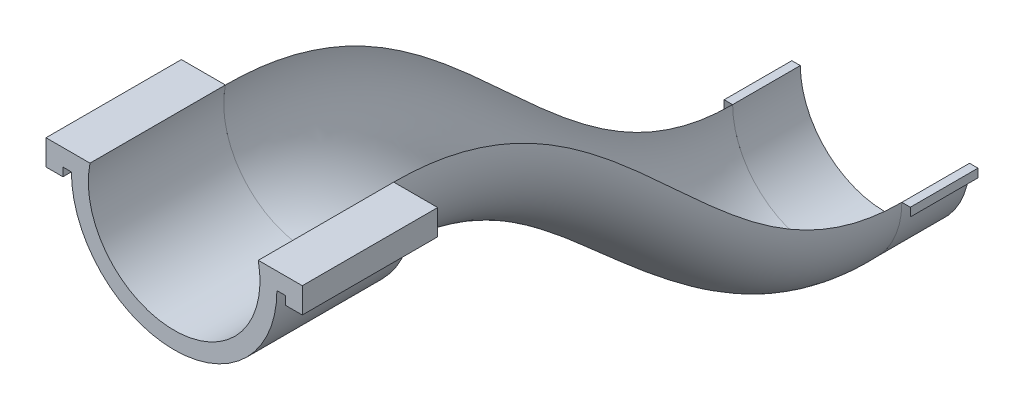
ISO-10303-21;
HEADER;
FILE_DESCRIPTION(('STEP AP214'),'2;1');
FILE_NAME('part.step','',(''),(''),'','','');
FILE_SCHEMA(('AUTOMOTIVE_DESIGN { 1 0 10303 214 1 1 1 1 }'));
ENDSEC;
DATA;
#1=APPLICATION_CONTEXT('core data for automotive mechanical design processes');
#2=APPLICATION_PROTOCOL_DEFINITION('international standard','automotive_design',2000,#1);
#3=PRODUCT_CONTEXT('',#1,'mechanical');
#4=PRODUCT('Part','Part','',(#3));
#5=PRODUCT_RELATED_PRODUCT_CATEGORY('part','',(#4));
#6=PRODUCT_DEFINITION_FORMATION('','',#4);
#7=PRODUCT_DEFINITION_CONTEXT('part definition',#1,'design');
#8=PRODUCT_DEFINITION('design','',#6,#7);
#9=PRODUCT_DEFINITION_SHAPE('','',#8);
#10=(LENGTH_UNIT() NAMED_UNIT(*) SI_UNIT(.MILLI.,.METRE.));
#11=(NAMED_UNIT(*) PLANE_ANGLE_UNIT() SI_UNIT($,.RADIAN.));
#12=(NAMED_UNIT(*) SI_UNIT($,.STERADIAN.) SOLID_ANGLE_UNIT());
#13=UNCERTAINTY_MEASURE_WITH_UNIT(LENGTH_MEASURE(1.E-05),#10,'distance_accuracy_value','');
#14=(GEOMETRIC_REPRESENTATION_CONTEXT(3) GLOBAL_UNCERTAINTY_ASSIGNED_CONTEXT((#13)) GLOBAL_UNIT_ASSIGNED_CONTEXT((#10,
#11,#12)) REPRESENTATION_CONTEXT('',''));
#15=CARTESIAN_POINT('',(0.,0.,0.));
#16=DIRECTION('',(0.,0.,1.));
#17=DIRECTION('',(1.,0.,0.));
#18=AXIS2_PLACEMENT_3D('',#15,#16,#17);
#19=CARTESIAN_POINT('',(-49.9995961359069,49.7990367043275,-300.));
#20=CARTESIAN_POINT('',(-49.9995961359069,49.7990367043276,-186.635093062161));
#21=CARTESIAN_POINT('',(-49.7236529956355,209.999999999992,-137.521090849917));
#22=CARTESIAN_POINT('',(-49.7236529956355,210.,0.));
#23=CARTESIAN_POINT('',(-49.9857710790284,46.3593674942618,-300.));
#24=CARTESIAN_POINT('',(-50.2395997585209,46.2476525838238,-186.635093042549));
#25=CARTESIAN_POINT('',(-50.2289829285867,206.336900969051,-137.521090646186));
#26=CARTESIAN_POINT('',(-50.4828116080792,206.22518605862,0.));
#27=CARTESIAN_POINT('',(-49.2625450584069,39.6438335125289,-300.));
#28=CARTESIAN_POINT('',(-49.9618479299618,39.242949902246,-186.635093003326));
#29=CARTESIAN_POINT('',(-50.4197005537794,199.043029587628,-137.521090238725));
#30=CARTESIAN_POINT('',(-51.1190034253343,198.642145977353,0.));
#31=CARTESIAN_POINT('',(-46.2909459407242,30.2602417774451,-300.));
#32=CARTESIAN_POINT('',(-47.4575577692636,29.2910114273615,-186.63509294449));
#33=CARTESIAN_POINT('',(-48.4172122425995,188.522744372944,-137.521089627533));
#34=CARTESIAN_POINT('',(-49.5838240711389,187.553514022867,0.));
#35=CARTESIAN_POINT('',(-42.4104889861624,23.184107101713,-300.));
#36=CARTESIAN_POINT('',(-43.7867134492801,21.6765254672473,-186.63509289546));
#37=CARTESIAN_POINT('',(-44.9847246343059,180.369907128448,-137.521089118206));
#38=CARTESIAN_POINT('',(-46.3609490974236,178.862325493988,0.));
#39=CARTESIAN_POINT('',(-38.5626491381919,18.0665263114237,-299.999999999999));
#40=CARTESIAN_POINT('',(-39.9923028896601,16.1230413752315,-186.635092856236));
#41=CARTESIAN_POINT('',(-41.2667386247257,174.380519734706,-137.521088710745));
#42=CARTESIAN_POINT('',(-42.696392376194,172.437034798519,0.));
#43=CARTESIAN_POINT('',(-35.3309207200381,14.5269083367518,-300.));
#44=CARTESIAN_POINT('',(-36.7411982428594,12.259811063786,-186.635092826818));
#45=CARTESIAN_POINT('',(-38.013504195545,170.193677086487,-137.521088405149));
#46=CARTESIAN_POINT('',(-39.4237817183662,167.926579813527,0.));
#47=CARTESIAN_POINT('',(-31.7781191274317,11.3091398482944,-300.));
#48=CARTESIAN_POINT('',(-33.1076255255293,8.72887907961716,-186.6350927974));
#49=CARTESIAN_POINT('',(-34.3164067997583,166.349581606607,-137.521088099553));
#50=CARTESIAN_POINT('',(-35.6459131978559,163.769320837935,0.));
#51=CARTESIAN_POINT('',(-27.9285288436859,8.43914732918972,-300.));
#52=CARTESIAN_POINT('',(-29.1136633833439,5.56435656091234,-186.635092767983));
#53=CARTESIAN_POINT('',(-30.1953192454001,162.890529088302,-137.521087793957));
#54=CARTESIAN_POINT('',(-31.3804537850581,160.01573832003,0.));
#55=CARTESIAN_POINT('',(-23.8094488339025,5.94138201827792,-300.));
#56=CARTESIAN_POINT('',(-24.7834001165026,2.79937114965999,-186.635092738565));
#57=CARTESIAN_POINT('',(-25.6711191677679,159.85832357671,-137.521087488361));
#58=CARTESIAN_POINT('',(-26.6450704503679,156.716312708097,0.));
#59=CARTESIAN_POINT('',(-19.4413726456585,3.84109217588112,-300.));
#60=CARTESIAN_POINT('',(-20.1882942934233,0.492863891781062,-186.635092709147));
#61=CARTESIAN_POINT('',(-20.8662301561201,157.345598903349,-137.521087182765));
#62=CARTESIAN_POINT('',(-21.6131518038848,153.997370619253,0.));
#63=CARTESIAN_POINT('',(-14.8581502520455,2.16309798919661,-300.));
#64=CARTESIAN_POINT('',(-15.3882543230493,-1.32683877520418,-186.635092679729));
#65=CARTESIAN_POINT('',(-15.8666190552523,155.384187756063,-137.521086877169));
#66=CARTESIAN_POINT('',(-16.3967231262561,151.894250991667,0.));
#67=CARTESIAN_POINT('',(-10.0682648029117,0.932449978969549,-300.));
#68=CARTESIAN_POINT('',(-10.3950198626838,-2.65006238087401,-186.635092650311));
#69=CARTESIAN_POINT('',(-10.6872820299221,153.968388554951,-137.521086571573));
#70=CARTESIAN_POINT('',(-11.0140370896942,150.385876195111,0.));
#71=CARTESIAN_POINT('',(-5.12838212363237,0.174073325261765,-300.));
#72=CARTESIAN_POINT('',(-5.26934241795265,-3.45625385484332,-186.635092620893));
#73=CARTESIAN_POINT('',(-5.39305626600597,153.11438226072,-137.521086265977));
#74=CARTESIAN_POINT('',(-5.53401656032624,149.484055080619,0.));
#75=CARTESIAN_POINT('',(-6.68724711022639E-09,-0.0870358964227742,-300.));
#76=CARTESIAN_POINT('',(8.97858296970237E-07,-3.73108305498303,-186.635092591475));
#77=CARTESIAN_POINT('',(1.80240383758125E-06,152.825833082125,-137.521085960381));
#78=CARTESIAN_POINT('',(2.7069493955395E-06,149.181785923569,0.));
#79=CARTESIAN_POINT('',(5.12838213970486,0.1740733383782,-300.));
#80=CARTESIAN_POINT('',(5.26934026213746,-3.45625478804245,-186.635092562057));
#81=CARTESIAN_POINT('',(5.3930519383031,153.114380381206,-137.521085654785));
#82=CARTESIAN_POINT('',(5.53401006073571,149.484052254789,0.));
#83=CARTESIAN_POINT('',(10.0682647776573,0.932449947445672,-300.));
#84=CARTESIAN_POINT('',(10.3950232305552,-2.65006015152915,-186.63509253264));
#85=CARTESIAN_POINT('',(10.6872887909192,153.968393045165,-137.521085349189));
#86=CARTESIAN_POINT('',(11.0140472438172,150.385882946194,0.));
#87=CARTESIAN_POINT('',(14.8581502966655,2.16309805183858,-300.));
#88=CARTESIAN_POINT('',(15.3882485276953,-1.32684308781143,-186.635092503222));
#89=CARTESIAN_POINT('',(15.8666074199243,155.384179068208,-137.521085043593));
#90=CARTESIAN_POINT('',(16.3967056509542,151.894237928561,0.));
#91=CARTESIAN_POINT('',(19.4413725637152,3.84109205691307,-300.000000000001));
#92=CARTESIAN_POINT('',(20.1883036844637,0.49287111052343,-186.635092473804));
#93=CARTESIAN_POINT('',(20.8662490201444,157.345613459803,-137.521084737997));
#94=CARTESIAN_POINT('',(21.6131801408929,153.997392513417,0.));
#95=CARTESIAN_POINT('',(23.8094489858663,5.94138224103554,-300.));
#96=CARTESIAN_POINT('',(24.7833929224077,2.79936562273601,-186.635092444386));
#97=CARTESIAN_POINT('',(25.6711046276143,159.858312300106,-137.521084432401));
#98=CARTESIAN_POINT('',(26.6450485641556,156.716295681809,0.));
#99=CARTESIAN_POINT('',(27.9285285633594,8.43914691713874,-300.));
#100=CARTESIAN_POINT('',(29.1135892981198,5.56429837061731,-186.635092414968));
#101=CARTESIAN_POINT('',(30.1951713552785,162.890413119766,-137.521084126805));
#102=CARTESIAN_POINT('',(31.3802320900389,160.015564573247,0.));
#103=CARTESIAN_POINT('',(31.7781196249931,11.309140580226,-300.));
#104=CARTESIAN_POINT('',(33.1075905681224,8.7288519057495,-186.63509238555));
#105=CARTESIAN_POINT('',(34.3163363873829,166.349526526943,-137.521083821209));
#106=CARTESIAN_POINT('',(35.6458073305123,163.769237852469,0.));
#107=CARTESIAN_POINT('',(35.3309200020894,14.5269072804505,-300.));
#108=CARTESIAN_POINT('',(36.7412203420088,12.2598280577145,-186.635092356133));
#109=CARTESIAN_POINT('',(38.0135491117925,170.193712130649,-137.521083515613));
#110=CARTESIAN_POINT('',(39.4238494517119,167.926632907915,0.));
#111=CARTESIAN_POINT('',(38.5626487651922,18.0665257619389,-300.));
#112=CARTESIAN_POINT('',(39.9923163888537,16.12305178541,-186.635092326715));
#113=CARTESIAN_POINT('',(41.2667659961126,174.380541104552,-137.521083210016));
#114=CARTESIAN_POINT('',(42.6964336197741,172.437067128025,0.));
#115=CARTESIAN_POINT('',(42.4105070338171,23.184133665319,-300.000000000001));
#116=CARTESIAN_POINT('',(43.7867043307883,21.6765265971737,-186.635092287492));
#117=CARTESIAN_POINT('',(44.9846883496677,180.369882824699,-137.521082802556));
#118=CARTESIAN_POINT('',(46.3608856466389,178.862275756555,0.));
#119=CARTESIAN_POINT('',(46.2909353677802,30.2602262156396,-299.999999999998));
#120=CARTESIAN_POINT('',(47.4575659714199,29.2910130075361,-186.63509223846));
#121=CARTESIAN_POINT('',(48.417239219856,188.522763095104,-137.521082293228));
#122=CARTESIAN_POINT('',(49.5838698234956,187.553549887002,0.));
#123=CARTESIAN_POINT('',(49.2625506154544,39.6438416916677,-300.000000000001));
#124=CARTESIAN_POINT('',(49.9618431816247,39.2429487288792,-186.635092179626));
#125=CARTESIAN_POINT('',(50.4196855000577,199.043019061763,-137.521081682037));
#126=CARTESIAN_POINT('',(51.1189780662281,198.642126098975,0.));
#127=CARTESIAN_POINT('',(49.9857710790284,46.3593674942618,-300.));
#128=CARTESIAN_POINT('',(50.2395997585209,46.2476525838238,-186.635092140402));
#129=CARTESIAN_POINT('',(50.2289829285867,206.336900969058,-137.521081274575));
#130=CARTESIAN_POINT('',(50.4828116080792,206.22518605862,0.));
#131=CARTESIAN_POINT('',(49.9995961359069,49.7990367043275,-300.));
#132=CARTESIAN_POINT('',(49.9995961359069,49.7990367043275,-186.63509212079));
#133=CARTESIAN_POINT('',(49.7236529956355,210.,-137.521081070844));
#134=CARTESIAN_POINT('',(49.7236529956355,210.,0.));
#135=B_SPLINE_SURFACE_WITH_KNOTS('',3,3,((#19,#20,#21,#22),(#23,#24,#25,#26),(#27,#28,#29,#30),
(#31,#32,#33,#34),(#35,#36,#37,#38),(#39,#40,#41,#42),(#43,#44,#45,#46),(#47,#48,#49,#50),(#51,
#52,#53,#54),(#55,#56,#57,#58),(#59,#60,#61,#62),(#63,#64,#65,#66),(#67,#68,#69,#70),(#71,#72,
#73,#74),(#75,#76,#77,#78),(#79,#80,#81,#82),(#83,#84,#85,#86),(#87,#88,#89,#90),(#91,#92,#93,
#94),(#95,#96,#97,#98),(#99,#100,#101,#102),(#103,#104,#105,#106),(#107,#108,#109,#110),(#111,
#112,#113,#114),(#115,#116,#117,#118),(#119,#120,#121,#122),(#123,#124,#125,#126),(#127,#128,
#129,#130),(#131,#132,#133,#134)),.UNSPECIFIED.,.F.,.F.,.F.,(4,1,1,1,1,1,1,1,1,1,1,1,1,1,1,1,1,
1,1,1,1,1,1,1,1,1,4),(4,4),(0.,0.0625,0.125,0.1875,0.21875,0.25,0.28125,0.3125,0.34375,0.375,
0.40625,0.4375,0.46875,0.5,0.53125,0.5625,0.59375,0.625,0.65625,0.6875,0.71875,0.75,0.78125,
0.8125,0.875,0.9375,1.),(0.,1.),.UNSPECIFIED.);
#136=CARTESIAN_POINT('',(-49.9995961359069,49.7990367043275,-300.));
#137=CARTESIAN_POINT('',(-49.9857710790284,46.3593674942618,-300.));
#138=CARTESIAN_POINT('',(-49.2625450584069,39.6438335125289,-300.));
#139=CARTESIAN_POINT('',(-46.2909459407242,30.2602417774451,-300.));
#140=CARTESIAN_POINT('',(-42.4104889861624,23.184107101713,-300.));
#141=CARTESIAN_POINT('',(-38.5626491381919,18.0665263114237,-299.999999999999));
#142=CARTESIAN_POINT('',(-35.3309207200381,14.5269083367518,-300.));
#143=CARTESIAN_POINT('',(-31.7781191274317,11.3091398482944,-300.));
#144=CARTESIAN_POINT('',(-27.9285288436859,8.43914732918972,-300.));
#145=CARTESIAN_POINT('',(-23.8094488339025,5.94138201827792,-300.));
#146=CARTESIAN_POINT('',(-19.4413726456585,3.84109217588112,-300.));
#147=CARTESIAN_POINT('',(-14.8581502520455,2.16309798919661,-300.));
#148=CARTESIAN_POINT('',(-10.0682648029117,0.932449978969549,-300.));
#149=CARTESIAN_POINT('',(-5.12838212363237,0.174073325261765,-300.));
#150=CARTESIAN_POINT('',(-6.68724711022639E-09,-0.0870358964227742,-300.));
#151=CARTESIAN_POINT('',(5.12838213970486,0.1740733383782,-300.));
#152=CARTESIAN_POINT('',(10.0682647776573,0.932449947445672,-300.));
#153=CARTESIAN_POINT('',(14.8581502966655,2.16309805183858,-300.));
#154=CARTESIAN_POINT('',(19.4413725637152,3.84109205691307,-300.000000000001));
#155=CARTESIAN_POINT('',(23.8094489858663,5.94138224103554,-300.));
#156=CARTESIAN_POINT('',(27.9285285633594,8.43914691713874,-300.));
#157=CARTESIAN_POINT('',(31.7781196249931,11.309140580226,-300.));
#158=CARTESIAN_POINT('',(35.3309200020894,14.5269072804505,-300.));
#159=CARTESIAN_POINT('',(38.5626487651922,18.0665257619389,-300.));
#160=CARTESIAN_POINT('',(42.4105070338171,23.184133665319,-300.000000000001));
#161=CARTESIAN_POINT('',(46.2909353677802,30.2602262156396,-299.999999999998));
#162=CARTESIAN_POINT('',(49.2625506154544,39.6438416916677,-300.000000000001));
#163=CARTESIAN_POINT('',(49.9857710790284,46.3593674942618,-300.));
#164=CARTESIAN_POINT('',(49.9995961359069,49.7990367043275,-300.));
#165=B_SPLINE_CURVE_WITH_KNOTS('',3,(#136,#137,#138,#139,#140,#141,#142,#143,#144,#145,#146,
#147,#148,#149,#150,#151,#152,#153,#154,#155,#156,#157,#158,#159,#160,#161,#162,#163,#164),
.UNSPECIFIED.,.F.,.F.,(4,1,1,1,1,1,1,1,1,1,1,1,1,1,1,1,1,1,1,1,1,1,1,1,1,1,4),(0.,0.0625,0.125,
0.1875,0.21875,0.25,0.28125,0.3125,0.34375,0.375,0.40625,0.4375,0.46875,0.5,0.53125,0.5625,
0.59375,0.625,0.65625,0.6875,0.71875,0.75,0.78125,0.8125,0.875,0.9375,1.),.UNSPECIFIED.);
#166=CARTESIAN_POINT('',(-49.9995961359069,49.7990367043275,-300.));
#167=VERTEX_POINT('',#166);
#168=CARTESIAN_POINT('',(49.9995961359069,49.7990367043275,-300.));
#169=VERTEX_POINT('',#168);
#170=EDGE_CURVE('E13',#167,#169,#165,.T.);
#171=CARTESIAN_POINT('',(49.9995961359069,49.7990367043275,-300.));
#172=CARTESIAN_POINT('',(49.9995961359069,49.7990367043275,-186.63509212079));
#173=CARTESIAN_POINT('',(49.7236529956355,210.,-137.521081070844));
#174=CARTESIAN_POINT('',(49.7236529956355,210.,0.));
#175=B_SPLINE_CURVE_WITH_KNOTS('',3,(#171,#172,#173,#174),.UNSPECIFIED.,.F.,.F.,(4,4),(0.,1.),.UNSPECIFIED.);
#176=CARTESIAN_POINT('',(49.7236529956355,210.,0.));
#177=VERTEX_POINT('',#176);
#178=EDGE_CURVE('E71',#169,#177,#175,.T.);
#179=CARTESIAN_POINT('',(-49.7236529956355,210.,0.));
#180=CARTESIAN_POINT('',(-50.4828116080792,206.22518605862,0.));
#181=CARTESIAN_POINT('',(-51.1190034253343,198.642145977353,0.));
#182=CARTESIAN_POINT('',(-49.5838240711389,187.553514022867,0.));
#183=CARTESIAN_POINT('',(-46.3609490974236,178.862325493988,0.));
#184=CARTESIAN_POINT('',(-42.696392376194,172.437034798519,0.));
#185=CARTESIAN_POINT('',(-39.4237817183662,167.926579813527,0.));
#186=CARTESIAN_POINT('',(-35.6459131978559,163.769320837935,0.));
#187=CARTESIAN_POINT('',(-31.3804537850581,160.01573832003,0.));
#188=CARTESIAN_POINT('',(-26.6450704503679,156.716312708097,0.));
#189=CARTESIAN_POINT('',(-21.6131518038848,153.997370619253,0.));
#190=CARTESIAN_POINT('',(-16.3967231262561,151.894250991667,0.));
#191=CARTESIAN_POINT('',(-11.0140370896942,150.385876195111,0.));
#192=CARTESIAN_POINT('',(-5.53401656032624,149.484055080619,0.));
#193=CARTESIAN_POINT('',(2.7069493955395E-06,149.181785923569,0.));
#194=CARTESIAN_POINT('',(5.53401006073571,149.484052254789,0.));
#195=CARTESIAN_POINT('',(11.0140472438172,150.385882946194,0.));
#196=CARTESIAN_POINT('',(16.3967056509542,151.894237928561,0.));
#197=CARTESIAN_POINT('',(21.6131801408929,153.997392513417,0.));
#198=CARTESIAN_POINT('',(26.6450485641556,156.716295681809,0.));
#199=CARTESIAN_POINT('',(31.3802320900389,160.015564573247,0.));
#200=CARTESIAN_POINT('',(35.6458073305123,163.769237852469,0.));
#201=CARTESIAN_POINT('',(39.4238494517119,167.926632907915,0.));
#202=CARTESIAN_POINT('',(42.6964336197741,172.437067128025,0.));
#203=CARTESIAN_POINT('',(46.3608856466389,178.862275756555,0.));
#204=CARTESIAN_POINT('',(49.5838698234956,187.553549887002,0.));
#205=CARTESIAN_POINT('',(51.1189780662281,198.642126098975,0.));
#206=CARTESIAN_POINT('',(50.4828116080792,206.22518605862,0.));
#207=CARTESIAN_POINT('',(49.7236529956355,210.,0.));
#208=B_SPLINE_CURVE_WITH_KNOTS('',3,(#179,#180,#181,#182,#183,#184,#185,#186,#187,#188,#189,
#190,#191,#192,#193,#194,#195,#196,#197,#198,#199,#200,#201,#202,#203,#204,#205,#206,#207),
.UNSPECIFIED.,.F.,.F.,(4,1,1,1,1,1,1,1,1,1,1,1,1,1,1,1,1,1,1,1,1,1,1,1,1,1,4),(0.,0.0625,0.125,
0.1875,0.21875,0.25,0.28125,0.3125,0.34375,0.375,0.40625,0.4375,0.46875,0.5,0.53125,0.5625,
0.59375,0.625,0.65625,0.6875,0.71875,0.75,0.78125,0.8125,0.875,0.9375,1.),.UNSPECIFIED.);
#209=CARTESIAN_POINT('',(-49.7236529956355,210.,0.));
#210=VERTEX_POINT('',#209);
#211=EDGE_CURVE('E79',#177,#210,#208,.F.);
#212=CARTESIAN_POINT('',(-49.9995961359069,49.7990367043275,-300.));
#213=CARTESIAN_POINT('',(-49.9995961359069,49.7990367043276,-186.635093062161));
#214=CARTESIAN_POINT('',(-49.7236529956355,209.999999999992,-137.521090849917));
#215=CARTESIAN_POINT('',(-49.7236529956355,210.,0.));
#216=B_SPLINE_CURVE_WITH_KNOTS('',3,(#212,#213,#214,#215),.UNSPECIFIED.,.F.,.F.,(4,4),(0.,1.),.UNSPECIFIED.);
#217=EDGE_CURVE('E63',#210,#167,#216,.F.);
#218=ORIENTED_EDGE('',*,*,#170,.T.);
#219=ORIENTED_EDGE('',*,*,#178,.T.);
#220=ORIENTED_EDGE('',*,*,#211,.T.);
#221=ORIENTED_EDGE('',*,*,#217,.T.);
#222=EDGE_LOOP('',(#218,#219,#220,#221));
#223=FACE_BOUND('',#222,.T.);
#224=ADVANCED_FACE('F60',(#223),#135,.T.);
#225=OPEN_SHELL('',(#224));
#226=SHELL_BASED_SURFACE_MODEL('B2',(#225));
#227=CARTESIAN_POINT('',(-75.7192435593274,200.,80.));
#228=DIRECTION('',(1.,0.,0.));
#229=DIRECTION('',(0.,0.,-1.));
#230=AXIS2_PLACEMENT_3D('',#227,#228,#229);
#231=PLANE('',#230);
#232=DIRECTION('',(0.,1.,0.));
#233=VECTOR('',#232,1.);
#234=CARTESIAN_POINT('',(-75.7192435593274,200.,0.));
#235=LINE('',#234,#233);
#236=CARTESIAN_POINT('',(-75.7192435593274,210.,0.));
#237=VERTEX_POINT('',#236);
#238=CARTESIAN_POINT('',(-75.7192435593274,195.,0.));
#239=VERTEX_POINT('',#238);
#240=EDGE_CURVE('E260',#237,#239,#235,.F.);
#241=ORIENTED_EDGE('',*,*,#240,.T.);
#242=DIRECTION('',(0.,0.,-1.));
#243=VECTOR('',#242,1.);
#244=CARTESIAN_POINT('',(-75.7192435593274,195.,80.));
#245=LINE('',#244,#243);
#246=CARTESIAN_POINT('',(-75.7192435593274,195.,80.));
#247=VERTEX_POINT('',#246);
#248=EDGE_CURVE('E58',#247,#239,#245,.T.);
#249=ORIENTED_EDGE('',*,*,#248,.F.);
#250=DIRECTION('',(0.,1.,0.));
#251=VECTOR('',#250,1.);
#252=CARTESIAN_POINT('',(-75.7192435593274,200.,80.));
#253=LINE('',#252,#251);
#254=CARTESIAN_POINT('',(-75.7192435593274,210.,80.));
#255=VERTEX_POINT('',#254);
#256=EDGE_CURVE('E208',#255,#247,#253,.F.);
#257=ORIENTED_EDGE('',*,*,#256,.F.);
#258=DIRECTION('',(0.,0.,-1.));
#259=VECTOR('',#258,1.);
#260=CARTESIAN_POINT('',(-75.7192435593274,210.,80.));
#261=LINE('',#260,#259);
#262=EDGE_CURVE('E256',#255,#237,#261,.T.);
#263=ORIENTED_EDGE('',*,*,#262,.T.);
#264=EDGE_LOOP('',(#241,#249,#257,#263));
#265=FACE_BOUND('',#264,.T.);
#266=ADVANCED_FACE('F140',(#265),#231,.F.);
#267=CARTESIAN_POINT('',(-65.7192435593274,195.,80.));
#268=DIRECTION('',(0.,-1.,0.));
#269=DIRECTION('',(0.,0.,-1.));
#270=AXIS2_PLACEMENT_3D('',#267,#268,#269);
#271=PLANE('',#270);
#272=DIRECTION('',(-1.,0.,0.));
#273=VECTOR('',#272,1.);
#274=CARTESIAN_POINT('',(-65.7192435593274,195.,0.));
#275=LINE('',#274,#273);
#276=CARTESIAN_POINT('',(-65.7192435593274,195.,0.));
#277=VERTEX_POINT('',#276);
#278=EDGE_CURVE('E263',#277,#239,#275,.T.);
#279=ORIENTED_EDGE('',*,*,#278,.F.);
#280=DIRECTION('',(0.,0.,-1.));
#281=VECTOR('',#280,1.);
#282=CARTESIAN_POINT('',(-65.7192435593274,195.,80.));
#283=LINE('',#282,#281);
#284=CARTESIAN_POINT('',(-65.7192435593274,195.,80.));
#285=VERTEX_POINT('',#284);
#286=EDGE_CURVE('E148',#285,#277,#283,.T.);
#287=ORIENTED_EDGE('',*,*,#286,.F.);
#288=DIRECTION('',(-1.,0.,0.));
#289=VECTOR('',#288,1.);
#290=CARTESIAN_POINT('',(-65.7192435593274,195.,80.));
#291=LINE('',#290,#289);
#292=EDGE_CURVE('E325',#285,#247,#291,.T.);
#293=ORIENTED_EDGE('',*,*,#292,.T.);
#294=ORIENTED_EDGE('',*,*,#248,.T.);
#295=EDGE_LOOP('',(#279,#287,#293,#294));
#296=FACE_BOUND('',#295,.T.);
#297=ADVANCED_FACE('F312',(#296),#271,.T.);
#298=CARTESIAN_POINT('',(-65.7192435593274,200.,80.));
#299=DIRECTION('',(1.,0.,0.));
#300=DIRECTION('',(0.,0.,-1.));
#301=AXIS2_PLACEMENT_3D('',#298,#299,#300);
#302=PLANE('',#301);
#303=DIRECTION('',(0.,-1.,0.));
#304=VECTOR('',#303,1.);
#305=CARTESIAN_POINT('',(-65.7192435593274,200.,0.));
#306=LINE('',#305,#304);
#307=CARTESIAN_POINT('',(-65.7192435593274,200.,0.));
#308=VERTEX_POINT('',#307);
#309=EDGE_CURVE('E266',#308,#277,#306,.T.);
#310=ORIENTED_EDGE('',*,*,#309,.F.);
#311=DIRECTION('',(0.,0.,-1.));
#312=VECTOR('',#311,1.);
#313=CARTESIAN_POINT('',(-65.7192435593274,200.,80.));
#314=LINE('',#313,#312);
#315=CARTESIAN_POINT('',(-65.7192435593274,200.,80.));
#316=VERTEX_POINT('',#315);
#317=EDGE_CURVE('E302',#316,#308,#314,.T.);
#318=ORIENTED_EDGE('',*,*,#317,.F.);
#319=DIRECTION('',(0.,-1.,0.));
#320=VECTOR('',#319,1.);
#321=CARTESIAN_POINT('',(-65.7192435593274,200.,80.));
#322=LINE('',#321,#320);
#323=EDGE_CURVE('E309',#316,#285,#322,.T.);
#324=ORIENTED_EDGE('',*,*,#323,.T.);
#325=ORIENTED_EDGE('',*,*,#286,.T.);
#326=EDGE_LOOP('',(#310,#318,#324,#325));
#327=FACE_BOUND('',#326,.T.);
#328=ADVANCED_FACE('F307',(#327),#302,.T.);
#329=CARTESIAN_POINT('',(-60.7192435593274,200.,80.));
#330=DIRECTION('',(0.,-1.,0.));
#331=DIRECTION('',(0.,0.,-1.));
#332=AXIS2_PLACEMENT_3D('',#329,#330,#331);
#333=PLANE('',#332);
#334=DIRECTION('',(-1.,0.,0.));
#335=VECTOR('',#334,1.);
#336=CARTESIAN_POINT('',(-60.7192435593274,200.,0.));
#337=LINE('',#336,#335);
#338=CARTESIAN_POINT('',(-60.7192435593274,200.,0.));
#339=VERTEX_POINT('',#338);
#340=EDGE_CURVE('E269',#339,#308,#337,.T.);
#341=ORIENTED_EDGE('',*,*,#340,.F.);
#342=DIRECTION('',(0.,0.,-1.));
#343=VECTOR('',#342,1.);
#344=CARTESIAN_POINT('',(-60.7192435593274,200.,80.));
#345=LINE('',#344,#343);
#346=CARTESIAN_POINT('',(-60.7192435593274,200.,80.));
#347=VERTEX_POINT('',#346);
#348=EDGE_CURVE('E300',#347,#339,#345,.T.);
#349=ORIENTED_EDGE('',*,*,#348,.F.);
#350=DIRECTION('',(-1.,0.,0.));
#351=VECTOR('',#350,1.);
#352=CARTESIAN_POINT('',(-60.7192435593274,200.,80.));
#353=LINE('',#352,#351);
#354=EDGE_CURVE('E322',#347,#316,#353,.T.);
#355=ORIENTED_EDGE('',*,*,#354,.T.);
#356=ORIENTED_EDGE('',*,*,#317,.T.);
#357=EDGE_LOOP('',(#341,#349,#355,#356));
#358=FACE_BOUND('',#357,.T.);
#359=ADVANCED_FACE('F319',(#358),#333,.T.);
#360=CARTESIAN_POINT('',(0.,200.,80.));
#361=DIRECTION('',(0.,0.,-1.));
#362=DIRECTION('',(-1.,0.,0.));
#363=AXIS2_PLACEMENT_3D('',#360,#361,#362);
#364=CYLINDRICAL_SURFACE('',#363,60.7192435593274);
#365=CARTESIAN_POINT('',(0.,200.,0.));
#366=DIRECTION('',(0.,0.,-1.));
#367=DIRECTION('',(-1.,0.,0.));
#368=AXIS2_PLACEMENT_3D('',#365,#366,#367);
#369=CIRCLE('',#368,60.7192435593274);
#370=CARTESIAN_POINT('',(60.7192435593274,200.,0.));
#371=VERTEX_POINT('',#370);
#372=EDGE_CURVE('E272',#371,#339,#369,.T.);
#373=ORIENTED_EDGE('',*,*,#372,.F.);
#374=DIRECTION('',(0.,0.,-1.));
#375=VECTOR('',#374,1.);
#376=CARTESIAN_POINT('',(60.7192435593274,200.,80.));
#377=LINE('',#376,#375);
#378=CARTESIAN_POINT('',(60.7192435593274,200.,80.));
#379=VERTEX_POINT('',#378);
#380=EDGE_CURVE('E298',#379,#371,#377,.T.);
#381=ORIENTED_EDGE('',*,*,#380,.F.);
#382=CARTESIAN_POINT('',(0.,200.,80.));
#383=DIRECTION('',(0.,0.,-1.));
#384=DIRECTION('',(-1.,0.,0.));
#385=AXIS2_PLACEMENT_3D('',#382,#383,#384);
#386=CIRCLE('',#385,60.7192435593274);
#387=EDGE_CURVE('E327',#379,#347,#386,.T.);
#388=ORIENTED_EDGE('',*,*,#387,.T.);
#389=ORIENTED_EDGE('',*,*,#348,.T.);
#390=EDGE_LOOP('',(#373,#381,#388,#389));
#391=FACE_BOUND('',#390,.T.);
#392=ADVANCED_FACE('F427',(#391),#364,.T.);
#393=CARTESIAN_POINT('',(60.7192435593274,200.,80.));
#394=DIRECTION('',(0.,-1.,0.));
#395=DIRECTION('',(0.,0.,-1.));
#396=AXIS2_PLACEMENT_3D('',#393,#394,#395);
#397=PLANE('',#396);
#398=DIRECTION('',(-1.,0.,0.));
#399=VECTOR('',#398,1.);
#400=CARTESIAN_POINT('',(60.7192435593274,200.,0.));
#401=LINE('',#400,#399);
#402=CARTESIAN_POINT('',(65.721997062788,200.,0.));
#403=VERTEX_POINT('',#402);
#404=EDGE_CURVE('E275',#403,#371,#401,.T.);
#405=ORIENTED_EDGE('',*,*,#404,.F.);
#406=DIRECTION('',(0.,0.,-1.));
#407=VECTOR('',#406,1.);
#408=CARTESIAN_POINT('',(65.721997062788,200.,80.));
#409=LINE('',#408,#407);
#410=CARTESIAN_POINT('',(65.721997062788,200.,80.));
#411=VERTEX_POINT('',#410);
#412=EDGE_CURVE('E296',#411,#403,#409,.T.);
#413=ORIENTED_EDGE('',*,*,#412,.F.);
#414=DIRECTION('',(-1.,0.,0.));
#415=VECTOR('',#414,1.);
#416=CARTESIAN_POINT('',(60.7192435593274,200.,80.));
#417=LINE('',#416,#415);
#418=EDGE_CURVE('E333',#411,#379,#417,.T.);
#419=ORIENTED_EDGE('',*,*,#418,.T.);
#420=ORIENTED_EDGE('',*,*,#380,.T.);
#421=EDGE_LOOP('',(#405,#413,#419,#420));
#422=FACE_BOUND('',#421,.T.);
#423=ADVANCED_FACE('F418',(#422),#397,.T.);
#424=CARTESIAN_POINT('',(65.721997062788,200.,80.));
#425=DIRECTION('',(-1.,0.,0.));
#426=DIRECTION('',(0.,0.,1.));
#427=AXIS2_PLACEMENT_3D('',#424,#425,#426);
#428=PLANE('',#427);
#429=DIRECTION('',(0.,1.,0.));
#430=VECTOR('',#429,1.);
#431=CARTESIAN_POINT('',(65.721997062788,200.,0.));
#432=LINE('',#431,#430);
#433=CARTESIAN_POINT('',(65.721997062788,195.,0.));
#434=VERTEX_POINT('',#433);
#435=EDGE_CURVE('E278',#434,#403,#432,.T.);
#436=ORIENTED_EDGE('',*,*,#435,.F.);
#437=DIRECTION('',(0.,0.,-1.));
#438=VECTOR('',#437,1.);
#439=CARTESIAN_POINT('',(65.721997062788,195.,80.));
#440=LINE('',#439,#438);
#441=CARTESIAN_POINT('',(65.721997062788,195.,80.));
#442=VERTEX_POINT('',#441);
#443=EDGE_CURVE('E294',#442,#434,#440,.T.);
#444=ORIENTED_EDGE('',*,*,#443,.F.);
#445=DIRECTION('',(0.,1.,0.));
#446=VECTOR('',#445,1.);
#447=CARTESIAN_POINT('',(65.721997062788,200.,80.));
#448=LINE('',#447,#446);
#449=EDGE_CURVE('E336',#442,#411,#448,.T.);
#450=ORIENTED_EDGE('',*,*,#449,.T.);
#451=ORIENTED_EDGE('',*,*,#412,.T.);
#452=EDGE_LOOP('',(#436,#444,#450,#451));
#453=FACE_BOUND('',#452,.T.);
#454=ADVANCED_FACE('F348',(#453),#428,.T.);
#455=CARTESIAN_POINT('',(75.721997062788,195.,80.));
#456=DIRECTION('',(0.,-1.,0.));
#457=DIRECTION('',(0.,0.,-1.));
#458=AXIS2_PLACEMENT_3D('',#455,#456,#457);
#459=PLANE('',#458);
#460=DIRECTION('',(-1.,0.,0.));
#461=VECTOR('',#460,1.);
#462=CARTESIAN_POINT('',(75.721997062788,195.,0.));
#463=LINE('',#462,#461);
#464=CARTESIAN_POINT('',(75.721997062788,195.,0.));
#465=VERTEX_POINT('',#464);
#466=EDGE_CURVE('E281',#465,#434,#463,.T.);
#467=ORIENTED_EDGE('',*,*,#466,.F.);
#468=DIRECTION('',(0.,0.,-1.));
#469=VECTOR('',#468,1.);
#470=CARTESIAN_POINT('',(75.721997062788,195.,80.));
#471=LINE('',#470,#469);
#472=CARTESIAN_POINT('',(75.721997062788,195.,80.));
#473=VERTEX_POINT('',#472);
#474=EDGE_CURVE('E292',#473,#465,#471,.T.);
#475=ORIENTED_EDGE('',*,*,#474,.F.);
#476=DIRECTION('',(-1.,0.,0.));
#477=VECTOR('',#476,1.);
#478=CARTESIAN_POINT('',(75.721997062788,195.,80.));
#479=LINE('',#478,#477);
#480=EDGE_CURVE('E339',#473,#442,#479,.T.);
#481=ORIENTED_EDGE('',*,*,#480,.T.);
#482=ORIENTED_EDGE('',*,*,#443,.T.);
#483=EDGE_LOOP('',(#467,#475,#481,#482));
#484=FACE_BOUND('',#483,.T.);
#485=ADVANCED_FACE('F343',(#484),#459,.T.);
#486=CARTESIAN_POINT('',(75.721997062788,200.,80.));
#487=DIRECTION('',(-1.,0.,0.));
#488=DIRECTION('',(0.,0.,1.));
#489=AXIS2_PLACEMENT_3D('',#486,#487,#488);
#490=PLANE('',#489);
#491=DIRECTION('',(0.,1.,0.));
#492=VECTOR('',#491,1.);
#493=CARTESIAN_POINT('',(75.721997062788,200.,0.));
#494=LINE('',#493,#492);
#495=CARTESIAN_POINT('',(75.721997062788,210.,0.));
#496=VERTEX_POINT('',#495);
#497=EDGE_CURVE('E284',#465,#496,#494,.T.);
#498=ORIENTED_EDGE('',*,*,#497,.T.);
#499=DIRECTION('',(0.,0.,-1.));
#500=VECTOR('',#499,1.);
#501=CARTESIAN_POINT('',(75.721997062788,210.,80.));
#502=LINE('',#501,#500);
#503=CARTESIAN_POINT('',(75.721997062788,210.,80.));
#504=VERTEX_POINT('',#503);
#505=EDGE_CURVE('E251',#504,#496,#502,.T.);
#506=ORIENTED_EDGE('',*,*,#505,.F.);
#507=DIRECTION('',(0.,1.,0.));
#508=VECTOR('',#507,1.);
#509=CARTESIAN_POINT('',(75.721997062788,200.,80.));
#510=LINE('',#509,#508);
#511=EDGE_CURVE('E242',#473,#504,#510,.T.);
#512=ORIENTED_EDGE('',*,*,#511,.F.);
#513=ORIENTED_EDGE('',*,*,#474,.T.);
#514=EDGE_LOOP('',(#498,#506,#512,#513));
#515=FACE_BOUND('',#514,.T.);
#516=ADVANCED_FACE('F352',(#515),#490,.F.);
#517=CARTESIAN_POINT('',(60.7192435593274,210.,80.));
#518=DIRECTION('',(0.,-1.,0.));
#519=DIRECTION('',(0.,0.,-1.));
#520=AXIS2_PLACEMENT_3D('',#517,#518,#519);
#521=PLANE('',#520);
#522=DIRECTION('',(1.,0.,0.));
#523=VECTOR('',#522,1.);
#524=CARTESIAN_POINT('',(60.7192435593274,210.,0.));
#525=LINE('',#524,#523);
#526=CARTESIAN_POINT('',(49.7236529956355,210.,0.));
#527=VERTEX_POINT('',#526);
#528=EDGE_CURVE('E250',#496,#527,#525,.F.);
#529=ORIENTED_EDGE('',*,*,#528,.T.);
#530=DIRECTION('',(0.,0.,-1.));
#531=VECTOR('',#530,1.);
#532=CARTESIAN_POINT('',(49.7236529956355,210.,80.));
#533=LINE('',#532,#531);
#534=CARTESIAN_POINT('',(49.7236529956355,210.,80.));
#535=VERTEX_POINT('',#534);
#536=EDGE_CURVE('E247',#535,#527,#533,.T.);
#537=ORIENTED_EDGE('',*,*,#536,.F.);
#538=DIRECTION('',(1.,0.,0.));
#539=VECTOR('',#538,1.);
#540=CARTESIAN_POINT('',(60.7192435593274,210.,80.));
#541=LINE('',#540,#539);
#542=EDGE_CURVE('E235',#504,#535,#541,.F.);
#543=ORIENTED_EDGE('',*,*,#542,.F.);
#544=ORIENTED_EDGE('',*,*,#505,.T.);
#545=EDGE_LOOP('',(#529,#537,#543,#544));
#546=FACE_BOUND('',#545,.T.);
#547=ADVANCED_FACE('F248',(#546),#521,.F.);
#548=CARTESIAN_POINT('',(0.,200.,80.));
#549=DIRECTION('',(0.,0.,-1.));
#550=DIRECTION('',(-1.,0.,0.));
#551=AXIS2_PLACEMENT_3D('',#548,#549,#550);
#552=CYLINDRICAL_SURFACE('',#551,50.7192435593274);
#553=CARTESIAN_POINT('',(0.,200.,0.));
#554=DIRECTION('',(0.,0.,1.));
#555=DIRECTION('',(1.,0.,0.));
#556=AXIS2_PLACEMENT_3D('',#553,#554,#555);
#557=CIRCLE('',#556,50.7192435593274);
#558=CARTESIAN_POINT('',(-49.7236529956355,210.,0.));
#559=VERTEX_POINT('',#558);
#560=EDGE_CURVE('E196',#527,#559,#557,.F.);
#561=ORIENTED_EDGE('',*,*,#560,.T.);
#562=DIRECTION('',(0.,0.,-1.));
#563=VECTOR('',#562,1.);
#564=CARTESIAN_POINT('',(-49.7236529956355,210.,80.));
#565=LINE('',#564,#563);
#566=CARTESIAN_POINT('',(-49.7236529956355,210.,80.));
#567=VERTEX_POINT('',#566);
#568=EDGE_CURVE('E252',#567,#559,#565,.T.);
#569=ORIENTED_EDGE('',*,*,#568,.F.);
#570=CARTESIAN_POINT('',(0.,200.,80.));
#571=DIRECTION('',(0.,0.,1.));
#572=DIRECTION('',(1.,0.,0.));
#573=AXIS2_PLACEMENT_3D('',#570,#571,#572);
#574=CIRCLE('',#573,50.7192435593274);
#575=EDGE_CURVE('E239',#535,#567,#574,.F.);
#576=ORIENTED_EDGE('',*,*,#575,.F.);
#577=ORIENTED_EDGE('',*,*,#536,.T.);
#578=EDGE_LOOP('',(#561,#569,#576,#577));
#579=FACE_BOUND('',#578,.T.);
#580=ADVANCED_FACE('F254',(#579),#552,.F.);
#581=CARTESIAN_POINT('',(-60.7192435593274,210.,80.));
#582=DIRECTION('',(0.,-1.,0.));
#583=DIRECTION('',(0.,0.,-1.));
#584=AXIS2_PLACEMENT_3D('',#581,#582,#583);
#585=PLANE('',#584);
#586=DIRECTION('',(1.,0.,0.));
#587=VECTOR('',#586,1.);
#588=CARTESIAN_POINT('',(-60.7192435593274,210.,0.));
#589=LINE('',#588,#587);
#590=EDGE_CURVE('E202',#559,#237,#589,.F.);
#591=ORIENTED_EDGE('',*,*,#590,.T.);
#592=ORIENTED_EDGE('',*,*,#262,.F.);
#593=DIRECTION('',(1.,0.,0.));
#594=VECTOR('',#593,1.);
#595=CARTESIAN_POINT('',(-60.7192435593274,210.,80.));
#596=LINE('',#595,#594);
#597=EDGE_CURVE('E156',#567,#255,#596,.F.);
#598=ORIENTED_EDGE('',*,*,#597,.F.);
#599=ORIENTED_EDGE('',*,*,#568,.T.);
#600=EDGE_LOOP('',(#591,#592,#598,#599));
#601=FACE_BOUND('',#600,.T.);
#602=ADVANCED_FACE('F366',(#601),#585,.F.);
#603=CARTESIAN_POINT('',(0.,200.,80.));
#604=DIRECTION('',(0.,0.,-1.));
#605=DIRECTION('',(-1.,0.,0.));
#606=AXIS2_PLACEMENT_3D('',#603,#604,#605);
#607=PLANE('',#606);
#608=ORIENTED_EDGE('',*,*,#256,.T.);
#609=ORIENTED_EDGE('',*,*,#292,.F.);
#610=ORIENTED_EDGE('',*,*,#323,.F.);
#611=ORIENTED_EDGE('',*,*,#354,.F.);
#612=ORIENTED_EDGE('',*,*,#387,.F.);
#613=ORIENTED_EDGE('',*,*,#418,.F.);
#614=ORIENTED_EDGE('',*,*,#449,.F.);
#615=ORIENTED_EDGE('',*,*,#480,.F.);
#616=ORIENTED_EDGE('',*,*,#511,.T.);
#617=ORIENTED_EDGE('',*,*,#542,.T.);
#618=ORIENTED_EDGE('',*,*,#575,.T.);
#619=ORIENTED_EDGE('',*,*,#597,.T.);
#620=EDGE_LOOP('',(#608,#609,#610,#611,#612,#613,#614,#615,#616,#617,#618,#619));
#621=FACE_BOUND('',#620,.T.);
#622=ADVANCED_FACE('F237',(#621),#607,.F.);
#623=CARTESIAN_POINT('',(0.,200.,0.));
#624=DIRECTION('',(0.,0.,-1.));
#625=DIRECTION('',(-1.,0.,0.));
#626=AXIS2_PLACEMENT_3D('',#623,#624,#625);
#627=PLANE('',#626);
#628=ORIENTED_EDGE('',*,*,#240,.F.);
#629=ORIENTED_EDGE('',*,*,#590,.F.);
#630=ORIENTED_EDGE('',*,*,#560,.F.);
#631=ORIENTED_EDGE('',*,*,#528,.F.);
#632=ORIENTED_EDGE('',*,*,#497,.F.);
#633=ORIENTED_EDGE('',*,*,#466,.T.);
#634=ORIENTED_EDGE('',*,*,#435,.T.);
#635=ORIENTED_EDGE('',*,*,#404,.T.);
#636=ORIENTED_EDGE('',*,*,#372,.T.);
#637=ORIENTED_EDGE('',*,*,#340,.T.);
#638=ORIENTED_EDGE('',*,*,#309,.T.);
#639=ORIENTED_EDGE('',*,*,#278,.T.);
#640=EDGE_LOOP('',(#628,#629,#630,#631,#632,#633,#634,#635,#636,#637,#638,#639));
#641=FACE_BOUND('',#640,.T.);
#642=ADVANCED_FACE('F315',(#641),#627,.T.);
#643=CLOSED_SHELL('',(#266,#297,#328,#359,#392,#423,#454,#485,#516,#547,#580,#602,#622,#642));
#644=MANIFOLD_SOLID_BREP('B7',#643);
#645=CARTESIAN_POINT('',(54.9995961359069,49.7990367043275,-300.));
#646=DIRECTION('',(-1.,0.,0.));
#647=DIRECTION('',(0.,0.,1.));
#648=AXIS2_PLACEMENT_3D('',#645,#646,#647);
#649=PLANE('',#648);
#650=DIRECTION('',(0.,1.,0.));
#651=VECTOR('',#650,1.);
#652=CARTESIAN_POINT('',(54.9995961359069,49.7990367043275,-340.));
#653=LINE('',#652,#651);
#654=CARTESIAN_POINT('',(54.9995961359069,44.7990367043275,-340.));
#655=VERTEX_POINT('',#654);
#656=CARTESIAN_POINT('',(54.9995961359069,49.7990367043275,-340.));
#657=VERTEX_POINT('',#656);
#658=EDGE_CURVE('E561',#655,#657,#653,.T.);
#659=ORIENTED_EDGE('',*,*,#658,.F.);
#660=DIRECTION('',(0.,0.,-1.));
#661=VECTOR('',#660,1.);
#662=CARTESIAN_POINT('',(54.9995961359069,44.7990367043275,-300.));
#663=LINE('',#662,#661);
#664=CARTESIAN_POINT('',(54.9995961359069,44.7990367043275,-300.));
#665=VERTEX_POINT('',#664);
#666=EDGE_CURVE('E480',#665,#655,#663,.T.);
#667=ORIENTED_EDGE('',*,*,#666,.F.);
#668=DIRECTION('',(0.,1.,0.));
#669=VECTOR('',#668,1.);
#670=CARTESIAN_POINT('',(54.9995961359069,49.7990367043275,-300.));
#671=LINE('',#670,#669);
#672=CARTESIAN_POINT('',(54.9995961359069,49.7990367043275,-300.));
#673=VERTEX_POINT('',#672);
#674=EDGE_CURVE('E138',#665,#673,#671,.T.);
#675=ORIENTED_EDGE('',*,*,#674,.T.);
#676=DIRECTION('',(0.,0.,-1.));
#677=VECTOR('',#676,1.);
#678=CARTESIAN_POINT('',(54.9995961359069,49.7990367043275,-300.));
#679=LINE('',#678,#677);
#680=EDGE_CURVE('E474',#673,#657,#679,.T.);
#681=ORIENTED_EDGE('',*,*,#680,.T.);
#682=EDGE_LOOP('',(#659,#667,#675,#681));
#683=FACE_BOUND('',#682,.T.);
#684=ADVANCED_FACE('F472',(#683),#649,.T.);
#685=CARTESIAN_POINT('',(49.9995961359069,49.7990367043275,-300.));
#686=DIRECTION('',(0.,-1.,0.));
#687=DIRECTION('',(0.,0.,-1.));
#688=AXIS2_PLACEMENT_3D('',#685,#686,#687);
#689=PLANE('',#688);
#690=DIRECTION('',(-1.,0.,0.));
#691=VECTOR('',#690,1.);
#692=CARTESIAN_POINT('',(49.9995961359069,49.7990367043275,-340.));
#693=LINE('',#692,#691);
#694=CARTESIAN_POINT('',(49.9995961359069,49.7990367043275,-340.));
#695=VERTEX_POINT('',#694);
#696=EDGE_CURVE('E546',#657,#695,#693,.T.);
#697=ORIENTED_EDGE('',*,*,#696,.F.);
#698=ORIENTED_EDGE('',*,*,#680,.F.);
#699=DIRECTION('',(-1.,0.,0.));
#700=VECTOR('',#699,1.);
#701=CARTESIAN_POINT('',(49.9995961359069,49.7990367043275,-300.));
#702=LINE('',#701,#700);
#703=CARTESIAN_POINT('',(49.9995961359069,49.7990367043275,-300.));
#704=VERTEX_POINT('',#703);
#705=EDGE_CURVE('E559',#673,#704,#702,.T.);
#706=ORIENTED_EDGE('',*,*,#705,.T.);
#707=DIRECTION('',(0.,0.,-1.));
#708=VECTOR('',#707,1.);
#709=CARTESIAN_POINT('',(49.9995961359069,49.7990367043275,-300.));
#710=LINE('',#709,#708);
#711=EDGE_CURVE('E544',#704,#695,#710,.T.);
#712=ORIENTED_EDGE('',*,*,#711,.T.);
#713=EDGE_LOOP('',(#697,#698,#706,#712));
#714=FACE_BOUND('',#713,.T.);
#715=ADVANCED_FACE('F580',(#714),#689,.T.);
#716=CARTESIAN_POINT('',(0.,50.,-300.));
#717=DIRECTION('',(0.,0.,-1.));
#718=DIRECTION('',(-1.,0.,0.));
#719=AXIS2_PLACEMENT_3D('',#716,#717,#718);
#720=CYLINDRICAL_SURFACE('',#719,50.);
#721=CARTESIAN_POINT('',(0.,50.,-340.));
#722=DIRECTION('',(0.,0.,-1.));
#723=DIRECTION('',(-1.,0.,0.));
#724=AXIS2_PLACEMENT_3D('',#721,#722,#723);
#725=CIRCLE('',#724,50.);
#726=CARTESIAN_POINT('',(-49.9995961359069,49.7990367043275,-340.));
#727=VERTEX_POINT('',#726);
#728=EDGE_CURVE('E539',#695,#727,#725,.T.);
#729=ORIENTED_EDGE('',*,*,#728,.F.);
#730=ORIENTED_EDGE('',*,*,#711,.F.);
#731=CARTESIAN_POINT('',(0.,50.,-300.));
#732=DIRECTION('',(0.,0.,-1.));
#733=DIRECTION('',(-1.,0.,0.));
#734=AXIS2_PLACEMENT_3D('',#731,#732,#733);
#735=CIRCLE('',#734,50.);
#736=CARTESIAN_POINT('',(-49.9995961359069,49.7990367043275,-300.));
#737=VERTEX_POINT('',#736);
#738=EDGE_CURVE('E542',#704,#737,#735,.T.);
#739=ORIENTED_EDGE('',*,*,#738,.T.);
#740=DIRECTION('',(0.,0.,-1.));
#741=VECTOR('',#740,1.);
#742=CARTESIAN_POINT('',(-49.9995961359069,49.7990367043275,-300.));
#743=LINE('',#742,#741);
#744=EDGE_CURVE('E527',#737,#727,#743,.T.);
#745=ORIENTED_EDGE('',*,*,#744,.T.);
#746=EDGE_LOOP('',(#729,#730,#739,#745));
#747=FACE_BOUND('',#746,.T.);
#748=ADVANCED_FACE('F543',(#747),#720,.T.);
#749=CARTESIAN_POINT('',(-49.9995961359069,49.7990367043275,-300.));
#750=DIRECTION('',(0.,-1.,0.));
#751=DIRECTION('',(0.,0.,-1.));
#752=AXIS2_PLACEMENT_3D('',#749,#750,#751);
#753=PLANE('',#752);
#754=DIRECTION('',(-1.,0.,0.));
#755=VECTOR('',#754,1.);
#756=CARTESIAN_POINT('',(-49.9995961359069,49.7990367043275,-340.));
#757=LINE('',#756,#755);
#758=CARTESIAN_POINT('',(-54.9995961359069,49.7990367043275,-340.));
#759=VERTEX_POINT('',#758);
#760=EDGE_CURVE('E532',#727,#759,#757,.T.);
#761=ORIENTED_EDGE('',*,*,#760,.F.);
#762=ORIENTED_EDGE('',*,*,#744,.F.);
#763=DIRECTION('',(-1.,0.,0.));
#764=VECTOR('',#763,1.);
#765=CARTESIAN_POINT('',(-49.9995961359069,49.7990367043275,-300.));
#766=LINE('',#765,#764);
#767=CARTESIAN_POINT('',(-54.9995961359069,49.7990367043275,-300.));
#768=VERTEX_POINT('',#767);
#769=EDGE_CURVE('E530',#737,#768,#766,.T.);
#770=ORIENTED_EDGE('',*,*,#769,.T.);
#771=DIRECTION('',(0.,0.,-1.));
#772=VECTOR('',#771,1.);
#773=CARTESIAN_POINT('',(-54.9995961359069,49.7990367043275,-300.));
#774=LINE('',#773,#772);
#775=EDGE_CURVE('E509',#768,#759,#774,.T.);
#776=ORIENTED_EDGE('',*,*,#775,.T.);
#777=EDGE_LOOP('',(#761,#762,#770,#776));
#778=FACE_BOUND('',#777,.T.);
#779=ADVANCED_FACE('F529',(#778),#753,.T.);
#780=CARTESIAN_POINT('',(-54.9995961359069,49.7990367043275,-300.));
#781=DIRECTION('',(1.,0.,0.));
#782=DIRECTION('',(0.,0.,-1.));
#783=AXIS2_PLACEMENT_3D('',#780,#781,#782);
#784=PLANE('',#783);
#785=DIRECTION('',(0.,-1.,0.));
#786=VECTOR('',#785,1.);
#787=CARTESIAN_POINT('',(-54.9995961359069,49.7990367043275,-340.));
#788=LINE('',#787,#786);
#789=CARTESIAN_POINT('',(-54.9995961359069,44.7990367043275,-340.));
#790=VERTEX_POINT('',#789);
#791=EDGE_CURVE('E566',#759,#790,#788,.T.);
#792=ORIENTED_EDGE('',*,*,#791,.F.);
#793=ORIENTED_EDGE('',*,*,#775,.F.);
#794=DIRECTION('',(0.,-1.,0.));
#795=VECTOR('',#794,1.);
#796=CARTESIAN_POINT('',(-54.9995961359069,49.7990367043275,-300.));
#797=LINE('',#796,#795);
#798=CARTESIAN_POINT('',(-54.9995961359069,44.7990367043275,-300.));
#799=VERTEX_POINT('',#798);
#800=EDGE_CURVE('E556',#768,#799,#797,.T.);
#801=ORIENTED_EDGE('',*,*,#800,.T.);
#802=DIRECTION('',(0.,0.,-1.));
#803=VECTOR('',#802,1.);
#804=CARTESIAN_POINT('',(-54.9995961359069,44.7990367043275,-300.));
#805=LINE('',#804,#803);
#806=EDGE_CURVE('E486',#799,#790,#805,.T.);
#807=ORIENTED_EDGE('',*,*,#806,.T.);
#808=EDGE_LOOP('',(#792,#793,#801,#807));
#809=FACE_BOUND('',#808,.T.);
#810=ADVANCED_FACE('F590',(#809),#784,.T.);
#811=OPEN_SHELL('',(#684,#715,#748,#779,#810));
#812=SHELL_BASED_SURFACE_MODEL('B52',(#811));
#813=ADVANCED_BREP_SHAPE_REPRESENTATION('',(#18,#644),#14);
#814=MANIFOLD_SURFACE_SHAPE_REPRESENTATION('',(#18,#226,#812),#14);
#815=SHAPE_REPRESENTATION('',(#18),#14);
#816=SHAPE_DEFINITION_REPRESENTATION(#9,#815);
#817=SHAPE_REPRESENTATION_RELATIONSHIP('','',#815,#813);
#818=SHAPE_REPRESENTATION_RELATIONSHIP('','',#815,#814);
ENDSEC;
END-ISO-10303-21;
